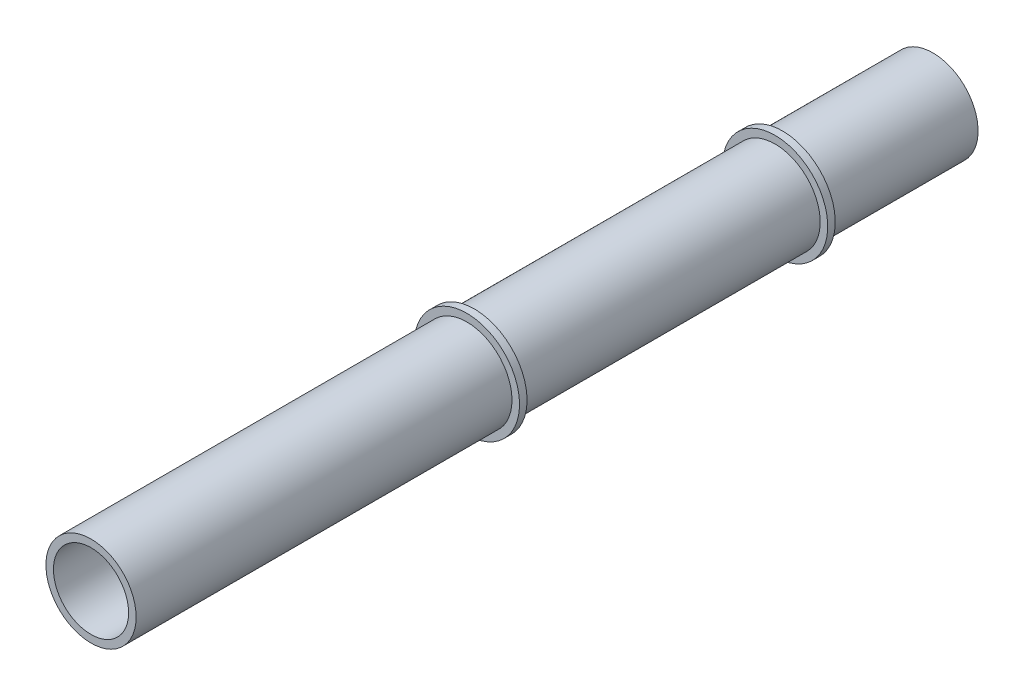
ISO-10303-21;
HEADER;
FILE_DESCRIPTION(('STEP AP214'),'2;1');
FILE_NAME('part.step','',(''),(''),'','','');
FILE_SCHEMA(('AUTOMOTIVE_DESIGN { 1 0 10303 214 1 1 1 1 }'));
ENDSEC;
DATA;
#1=APPLICATION_CONTEXT('core data for automotive mechanical design processes');
#2=APPLICATION_PROTOCOL_DEFINITION('international standard','automotive_design',2000,#1);
#3=PRODUCT_CONTEXT('',#1,'mechanical');
#4=PRODUCT('Part','Part','',(#3));
#5=PRODUCT_RELATED_PRODUCT_CATEGORY('part','',(#4));
#6=PRODUCT_DEFINITION_FORMATION('','',#4);
#7=PRODUCT_DEFINITION_CONTEXT('part definition',#1,'design');
#8=PRODUCT_DEFINITION('design','',#6,#7);
#9=PRODUCT_DEFINITION_SHAPE('','',#8);
#10=(LENGTH_UNIT() NAMED_UNIT(*) SI_UNIT(.MILLI.,.METRE.));
#11=(NAMED_UNIT(*) PLANE_ANGLE_UNIT() SI_UNIT($,.RADIAN.));
#12=(NAMED_UNIT(*) SI_UNIT($,.STERADIAN.) SOLID_ANGLE_UNIT());
#13=UNCERTAINTY_MEASURE_WITH_UNIT(LENGTH_MEASURE(1.E-05),#10,'distance_accuracy_value','');
#14=(GEOMETRIC_REPRESENTATION_CONTEXT(3) GLOBAL_UNCERTAINTY_ASSIGNED_CONTEXT((#13)) GLOBAL_UNIT_ASSIGNED_CONTEXT((#10,
#11,#12)) REPRESENTATION_CONTEXT('',''));
#15=CARTESIAN_POINT('',(0.,0.,0.));
#16=DIRECTION('',(0.,0.,1.));
#17=DIRECTION('',(1.,0.,0.));
#18=AXIS2_PLACEMENT_3D('',#15,#16,#17);
#19=CARTESIAN_POINT('',(0.,0.,-41.));
#20=DIRECTION('',(0.,0.,1.));
#21=DIRECTION('',(1.,0.,0.));
#22=AXIS2_PLACEMENT_3D('',#19,#20,#21);
#23=CYLINDRICAL_SURFACE('',#22,6.);
#24=CARTESIAN_POINT('',(0.,0.,-41.));
#25=DIRECTION('',(0.,0.,-1.));
#26=DIRECTION('',(-1.,0.,0.));
#27=AXIS2_PLACEMENT_3D('',#24,#25,#26);
#28=CIRCLE('',#27,6.);
#29=CARTESIAN_POINT('',(-6.,0.,-41.));
#30=VERTEX_POINT('',#29);
#31=EDGE_CURVE('E47',#30,#30,#28,.T.);
#32=ORIENTED_EDGE('',*,*,#31,.F.);
#33=EDGE_LOOP('',(#32));
#34=FACE_BOUND('',#33,.T.);
#35=CARTESIAN_POINT('',(0.,0.,-1.));
#36=DIRECTION('',(0.,0.,-1.));
#37=DIRECTION('',(-1.,0.,0.));
#38=AXIS2_PLACEMENT_3D('',#35,#36,#37);
#39=CIRCLE('',#38,6.);
#40=CARTESIAN_POINT('',(-6.,0.,-1.));
#41=VERTEX_POINT('',#40);
#42=EDGE_CURVE('E43',#41,#41,#39,.T.);
#43=ORIENTED_EDGE('',*,*,#42,.T.);
#44=EDGE_LOOP('',(#43));
#45=FACE_BOUND('',#44,.T.);
#46=ADVANCED_FACE('F40',(#34,#45),#23,.T.);
#47=CARTESIAN_POINT('',(0.,0.,-1.));
#48=DIRECTION('',(0.,0.,-1.));
#49=DIRECTION('',(-1.,0.,0.));
#50=AXIS2_PLACEMENT_3D('',#47,#48,#49);
#51=PLANE('',#50);
#52=CARTESIAN_POINT('',(0.,0.,-1.));
#53=DIRECTION('',(0.,0.,-1.));
#54=DIRECTION('',(-1.,0.,0.));
#55=AXIS2_PLACEMENT_3D('',#52,#53,#54);
#56=CIRCLE('',#55,5.);
#57=CARTESIAN_POINT('',(-5.,0.,-1.));
#58=VERTEX_POINT('',#57);
#59=EDGE_CURVE('E64',#58,#58,#56,.T.);
#60=ORIENTED_EDGE('',*,*,#59,.T.);
#61=EDGE_LOOP('',(#60));
#62=FACE_BOUND('',#61,.T.);
#63=ORIENTED_EDGE('',*,*,#42,.F.);
#64=EDGE_LOOP('',(#63));
#65=FACE_BOUND('',#64,.T.);
#66=ADVANCED_FACE('F91',(#62,#65),#51,.F.);
#67=CARTESIAN_POINT('',(0.,0.,-42.));
#68=DIRECTION('',(0.,0.,1.));
#69=DIRECTION('',(1.,0.,0.));
#70=AXIS2_PLACEMENT_3D('',#67,#68,#69);
#71=CYLINDRICAL_SURFACE('',#70,7.);
#72=CARTESIAN_POINT('',(0.,0.,-42.));
#73=DIRECTION('',(0.,0.,-1.));
#74=DIRECTION('',(-1.,0.,0.));
#75=AXIS2_PLACEMENT_3D('',#72,#73,#74);
#76=CIRCLE('',#75,7.);
#77=CARTESIAN_POINT('',(-7.,0.,-42.));
#78=VERTEX_POINT('',#77);
#79=EDGE_CURVE('E56',#78,#78,#76,.T.);
#80=ORIENTED_EDGE('',*,*,#79,.F.);
#81=EDGE_LOOP('',(#80));
#82=FACE_BOUND('',#81,.T.);
#83=CARTESIAN_POINT('',(0.,0.,-41.));
#84=DIRECTION('',(0.,0.,-1.));
#85=DIRECTION('',(-1.,0.,0.));
#86=AXIS2_PLACEMENT_3D('',#83,#84,#85);
#87=CIRCLE('',#86,7.);
#88=CARTESIAN_POINT('',(-7.,0.,-41.));
#89=VERTEX_POINT('',#88);
#90=EDGE_CURVE('E59',#89,#89,#87,.T.);
#91=ORIENTED_EDGE('',*,*,#90,.T.);
#92=EDGE_LOOP('',(#91));
#93=FACE_BOUND('',#92,.T.);
#94=ADVANCED_FACE('F96',(#82,#93),#71,.T.);
#95=CARTESIAN_POINT('',(0.,0.,-42.));
#96=DIRECTION('',(0.,0.,-1.));
#97=DIRECTION('',(-1.,0.,0.));
#98=AXIS2_PLACEMENT_3D('',#95,#96,#97);
#99=PLANE('',#98);
#100=CARTESIAN_POINT('',(0.,0.,-42.));
#101=DIRECTION('',(0.,0.,-1.));
#102=DIRECTION('',(-1.,0.,0.));
#103=AXIS2_PLACEMENT_3D('',#100,#101,#102);
#104=CIRCLE('',#103,6.);
#105=CARTESIAN_POINT('',(-6.,0.,-42.));
#106=VERTEX_POINT('',#105);
#107=EDGE_CURVE('E11',#106,#106,#104,.T.);
#108=ORIENTED_EDGE('',*,*,#107,.F.);
#109=EDGE_LOOP('',(#108));
#110=FACE_BOUND('',#109,.T.);
#111=ORIENTED_EDGE('',*,*,#79,.T.);
#112=EDGE_LOOP('',(#111));
#113=FACE_BOUND('',#112,.T.);
#114=ADVANCED_FACE('F105',(#110,#113),#99,.T.);
#115=CARTESIAN_POINT('',(0.,0.,-41.));
#116=DIRECTION('',(0.,0.,-1.));
#117=DIRECTION('',(-1.,0.,0.));
#118=AXIS2_PLACEMENT_3D('',#115,#116,#117);
#119=PLANE('',#118);
#120=ORIENTED_EDGE('',*,*,#31,.T.);
#121=EDGE_LOOP('',(#120));
#122=FACE_BOUND('',#121,.T.);
#123=ORIENTED_EDGE('',*,*,#90,.F.);
#124=EDGE_LOOP('',(#123));
#125=FACE_BOUND('',#124,.T.);
#126=ADVANCED_FACE('F87',(#122,#125),#119,.F.);
#127=CARTESIAN_POINT('',(0.,0.,-62.));
#128=DIRECTION('',(0.,0.,1.));
#129=DIRECTION('',(1.,0.,0.));
#130=AXIS2_PLACEMENT_3D('',#127,#128,#129);
#131=CYLINDRICAL_SURFACE('',#130,6.);
#132=CARTESIAN_POINT('',(0.,0.,-62.));
#133=DIRECTION('',(0.,0.,-1.));
#134=DIRECTION('',(-1.,0.,0.));
#135=AXIS2_PLACEMENT_3D('',#132,#133,#134);
#136=CIRCLE('',#135,6.);
#137=CARTESIAN_POINT('',(-6.,0.,-62.));
#138=VERTEX_POINT('',#137);
#139=EDGE_CURVE('E54',#138,#138,#136,.T.);
#140=ORIENTED_EDGE('',*,*,#139,.F.);
#141=EDGE_LOOP('',(#140));
#142=FACE_BOUND('',#141,.T.);
#143=ORIENTED_EDGE('',*,*,#107,.T.);
#144=EDGE_LOOP('',(#143));
#145=FACE_BOUND('',#144,.T.);
#146=ADVANCED_FACE('F80',(#142,#145),#131,.T.);
#147=CARTESIAN_POINT('',(0.,0.,-62.));
#148=DIRECTION('',(0.,0.,-1.));
#149=DIRECTION('',(-1.,0.,0.));
#150=AXIS2_PLACEMENT_3D('',#147,#148,#149);
#151=PLANE('',#150);
#152=CARTESIAN_POINT('',(0.,0.,-62.));
#153=DIRECTION('',(0.,0.,-1.));
#154=DIRECTION('',(-1.,0.,0.));
#155=AXIS2_PLACEMENT_3D('',#152,#153,#154);
#156=CIRCLE('',#155,5.);
#157=CARTESIAN_POINT('',(-5.,0.,-62.));
#158=VERTEX_POINT('',#157);
#159=EDGE_CURVE('E68',#158,#158,#156,.T.);
#160=ORIENTED_EDGE('',*,*,#159,.F.);
#161=EDGE_LOOP('',(#160));
#162=FACE_BOUND('',#161,.T.);
#163=ORIENTED_EDGE('',*,*,#139,.T.);
#164=EDGE_LOOP('',(#163));
#165=FACE_BOUND('',#164,.T.);
#166=ADVANCED_FACE('F78',(#162,#165),#151,.T.);
#167=CARTESIAN_POINT('',(0.,0.,138.));
#168=DIRECTION('',(0.,0.,-1.));
#169=DIRECTION('',(-1.,0.,0.));
#170=AXIS2_PLACEMENT_3D('',#167,#168,#169);
#171=CYLINDRICAL_SURFACE('',#170,5.);
#172=ORIENTED_EDGE('',*,*,#159,.T.);
#173=EDGE_LOOP('',(#172));
#174=FACE_BOUND('',#173,.T.);
#175=ORIENTED_EDGE('',*,*,#59,.F.);
#176=EDGE_LOOP('',(#175));
#177=FACE_BOUND('',#176,.T.);
#178=ADVANCED_FACE('F75',(#174,#177),#171,.F.);
#179=CLOSED_SHELL('',(#46,#66,#94,#114,#126,#146,#166,#178));
#180=MANIFOLD_SOLID_BREP('B2',#179);
#181=CARTESIAN_POINT('',(0.,0.,-1.));
#182=DIRECTION('',(0.,0.,1.));
#183=DIRECTION('',(1.,0.,0.));
#184=AXIS2_PLACEMENT_3D('',#181,#182,#183);
#185=CYLINDRICAL_SURFACE('',#184,7.);
#186=CARTESIAN_POINT('',(0.,0.,-1.));
#187=DIRECTION('',(0.,0.,-1.));
#188=DIRECTION('',(-1.,0.,0.));
#189=AXIS2_PLACEMENT_3D('',#186,#187,#188);
#190=CIRCLE('',#189,7.);
#191=CARTESIAN_POINT('',(-7.,0.,-1.));
#192=VERTEX_POINT('',#191);
#193=EDGE_CURVE('E39',#192,#192,#190,.T.);
#194=ORIENTED_EDGE('',*,*,#193,.F.);
#195=EDGE_LOOP('',(#194));
#196=FACE_BOUND('',#195,.T.);
#197=CARTESIAN_POINT('',(0.,0.,0.));
#198=DIRECTION('',(0.,0.,-1.));
#199=DIRECTION('',(-1.,0.,0.));
#200=AXIS2_PLACEMENT_3D('',#197,#198,#199);
#201=CIRCLE('',#200,7.);
#202=CARTESIAN_POINT('',(-7.,0.,0.));
#203=VERTEX_POINT('',#202);
#204=EDGE_CURVE('E176',#203,#203,#201,.T.);
#205=ORIENTED_EDGE('',*,*,#204,.T.);
#206=EDGE_LOOP('',(#205));
#207=FACE_BOUND('',#206,.T.);
#208=ADVANCED_FACE('F169',(#196,#207),#185,.T.);
#209=CARTESIAN_POINT('',(0.,0.,-1.));
#210=DIRECTION('',(0.,0.,-1.));
#211=DIRECTION('',(-1.,0.,0.));
#212=AXIS2_PLACEMENT_3D('',#209,#210,#211);
#213=PLANE('',#212);
#214=CARTESIAN_POINT('',(0.,0.,-1.));
#215=DIRECTION('',(0.,0.,-1.));
#216=DIRECTION('',(-1.,0.,0.));
#217=AXIS2_PLACEMENT_3D('',#214,#215,#216);
#218=CIRCLE('',#217,5.);
#219=CARTESIAN_POINT('',(-5.,0.,-1.));
#220=VERTEX_POINT('',#219);
#221=EDGE_CURVE('E181',#220,#220,#218,.T.);
#222=ORIENTED_EDGE('',*,*,#221,.F.);
#223=EDGE_LOOP('',(#222));
#224=FACE_BOUND('',#223,.T.);
#225=ORIENTED_EDGE('',*,*,#193,.T.);
#226=EDGE_LOOP('',(#225));
#227=FACE_BOUND('',#226,.T.);
#228=ADVANCED_FACE('F198',(#224,#227),#213,.T.);
#229=CARTESIAN_POINT('',(0.,0.,0.));
#230=DIRECTION('',(0.,0.,-1.));
#231=DIRECTION('',(-1.,0.,0.));
#232=AXIS2_PLACEMENT_3D('',#229,#230,#231);
#233=PLANE('',#232);
#234=CARTESIAN_POINT('',(0.,0.,0.));
#235=DIRECTION('',(0.,0.,-1.));
#236=DIRECTION('',(-1.,0.,0.));
#237=AXIS2_PLACEMENT_3D('',#234,#235,#236);
#238=CIRCLE('',#237,5.);
#239=CARTESIAN_POINT('',(-5.,0.,0.));
#240=VERTEX_POINT('',#239);
#241=EDGE_CURVE('E172',#240,#240,#238,.T.);
#242=ORIENTED_EDGE('',*,*,#241,.T.);
#243=EDGE_LOOP('',(#242));
#244=FACE_BOUND('',#243,.T.);
#245=ORIENTED_EDGE('',*,*,#204,.F.);
#246=EDGE_LOOP('',(#245));
#247=FACE_BOUND('',#246,.T.);
#248=ADVANCED_FACE('F189',(#244,#247),#233,.F.);
#249=CARTESIAN_POINT('',(0.,0.,138.));
#250=DIRECTION('',(0.,0.,-1.));
#251=DIRECTION('',(-1.,0.,0.));
#252=AXIS2_PLACEMENT_3D('',#249,#250,#251);
#253=CYLINDRICAL_SURFACE('',#252,5.);
#254=ORIENTED_EDGE('',*,*,#221,.T.);
#255=EDGE_LOOP('',(#254));
#256=FACE_BOUND('',#255,.T.);
#257=ORIENTED_EDGE('',*,*,#241,.F.);
#258=EDGE_LOOP('',(#257));
#259=FACE_BOUND('',#258,.T.);
#260=ADVANCED_FACE('F192',(#256,#259),#253,.F.);
#261=CLOSED_SHELL('',(#208,#228,#248,#260));
#262=MANIFOLD_SOLID_BREP('B6',#261);
#263=CARTESIAN_POINT('',(0.,0.,50.));
#264=DIRECTION('',(0.,0.,-1.));
#265=DIRECTION('',(-1.,0.,0.));
#266=AXIS2_PLACEMENT_3D('',#263,#264,#265);
#267=CYLINDRICAL_SURFACE('',#266,6.);
#268=CARTESIAN_POINT('',(0.,0.,50.));
#269=DIRECTION('',(0.,0.,1.));
#270=DIRECTION('',(1.,0.,0.));
#271=AXIS2_PLACEMENT_3D('',#268,#269,#270);
#272=CIRCLE('',#271,6.);
#273=CARTESIAN_POINT('',(6.,0.,50.));
#274=VERTEX_POINT('',#273);
#275=EDGE_CURVE('E168',#274,#274,#272,.T.);
#276=ORIENTED_EDGE('',*,*,#275,.F.);
#277=EDGE_LOOP('',(#276));
#278=FACE_BOUND('',#277,.T.);
#279=CARTESIAN_POINT('',(0.,0.,0.));
#280=DIRECTION('',(0.,0.,1.));
#281=DIRECTION('',(1.,0.,0.));
#282=AXIS2_PLACEMENT_3D('',#279,#280,#281);
#283=CIRCLE('',#282,6.);
#284=CARTESIAN_POINT('',(6.,0.,0.));
#285=VERTEX_POINT('',#284);
#286=EDGE_CURVE('E238',#285,#285,#283,.T.);
#287=ORIENTED_EDGE('',*,*,#286,.T.);
#288=EDGE_LOOP('',(#287));
#289=FACE_BOUND('',#288,.T.);
#290=ADVANCED_FACE('F231',(#278,#289),#267,.T.);
#291=CARTESIAN_POINT('',(0.,0.,50.));
#292=DIRECTION('',(0.,0.,1.));
#293=DIRECTION('',(1.,0.,0.));
#294=AXIS2_PLACEMENT_3D('',#291,#292,#293);
#295=PLANE('',#294);
#296=CARTESIAN_POINT('',(0.,0.,50.));
#297=DIRECTION('',(0.,0.,1.));
#298=DIRECTION('',(1.,0.,0.));
#299=AXIS2_PLACEMENT_3D('',#296,#297,#298);
#300=CIRCLE('',#299,5.);
#301=CARTESIAN_POINT('',(5.,0.,50.));
#302=VERTEX_POINT('',#301);
#303=EDGE_CURVE('E243',#302,#302,#300,.T.);
#304=ORIENTED_EDGE('',*,*,#303,.F.);
#305=EDGE_LOOP('',(#304));
#306=FACE_BOUND('',#305,.T.);
#307=ORIENTED_EDGE('',*,*,#275,.T.);
#308=EDGE_LOOP('',(#307));
#309=FACE_BOUND('',#308,.T.);
#310=ADVANCED_FACE('F260',(#306,#309),#295,.T.);
#311=CARTESIAN_POINT('',(0.,0.,0.));
#312=DIRECTION('',(0.,0.,1.));
#313=DIRECTION('',(1.,0.,0.));
#314=AXIS2_PLACEMENT_3D('',#311,#312,#313);
#315=PLANE('',#314);
#316=CARTESIAN_POINT('',(0.,0.,0.));
#317=DIRECTION('',(0.,0.,1.));
#318=DIRECTION('',(1.,0.,0.));
#319=AXIS2_PLACEMENT_3D('',#316,#317,#318);
#320=CIRCLE('',#319,5.);
#321=CARTESIAN_POINT('',(5.,0.,0.));
#322=VERTEX_POINT('',#321);
#323=EDGE_CURVE('E234',#322,#322,#320,.T.);
#324=ORIENTED_EDGE('',*,*,#323,.T.);
#325=EDGE_LOOP('',(#324));
#326=FACE_BOUND('',#325,.T.);
#327=ORIENTED_EDGE('',*,*,#286,.F.);
#328=EDGE_LOOP('',(#327));
#329=FACE_BOUND('',#328,.T.);
#330=ADVANCED_FACE('F251',(#326,#329),#315,.F.);
#331=CARTESIAN_POINT('',(0.,0.,138.));
#332=DIRECTION('',(0.,0.,-1.));
#333=DIRECTION('',(-1.,0.,0.));
#334=AXIS2_PLACEMENT_3D('',#331,#332,#333);
#335=CYLINDRICAL_SURFACE('',#334,5.);
#336=ORIENTED_EDGE('',*,*,#303,.T.);
#337=EDGE_LOOP('',(#336));
#338=FACE_BOUND('',#337,.T.);
#339=ORIENTED_EDGE('',*,*,#323,.F.);
#340=EDGE_LOOP('',(#339));
#341=FACE_BOUND('',#340,.T.);
#342=ADVANCED_FACE('F254',(#338,#341),#335,.F.);
#343=CLOSED_SHELL('',(#290,#310,#330,#342));
#344=MANIFOLD_SOLID_BREP('B34',#343);
#345=ADVANCED_BREP_SHAPE_REPRESENTATION('',(#18,#180,#262,#344),#14);
#346=SHAPE_DEFINITION_REPRESENTATION(#9,#345);
ENDSEC;
END-ISO-10303-21;
